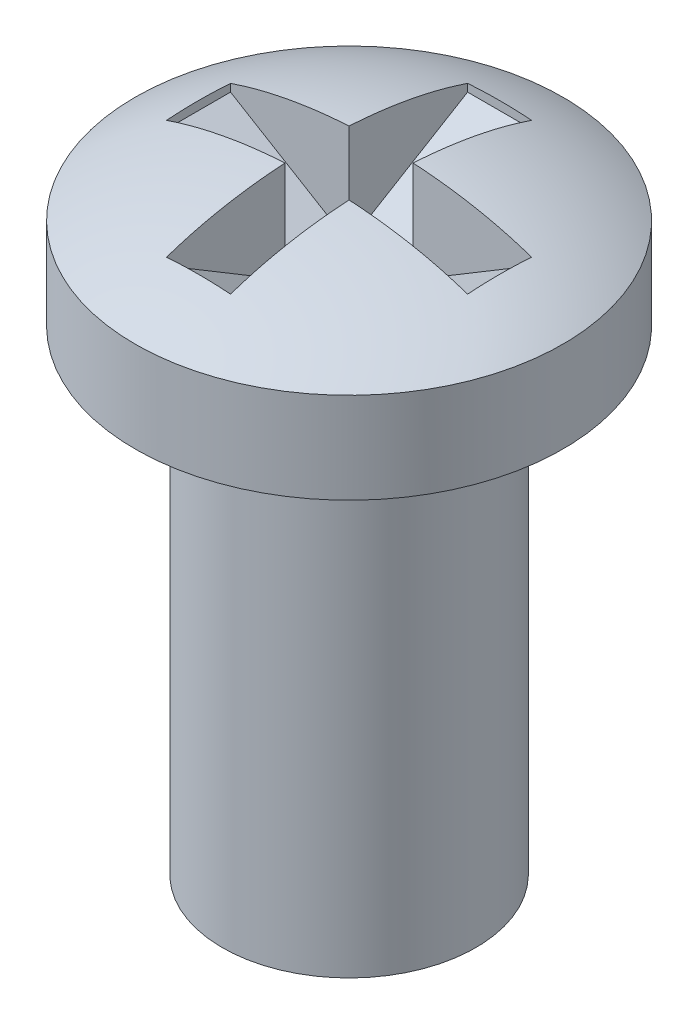
ISO-10303-21;
HEADER;
FILE_DESCRIPTION(('STEP AP214'),'2;1');
FILE_NAME('part.step','',(''),(''),'','','');
FILE_SCHEMA(('AUTOMOTIVE_DESIGN { 1 0 10303 214 1 1 1 1 }'));
ENDSEC;
DATA;
#1=APPLICATION_CONTEXT('core data for automotive mechanical design processes');
#2=APPLICATION_PROTOCOL_DEFINITION('international standard','automotive_design',2000,#1);
#3=PRODUCT_CONTEXT('',#1,'mechanical');
#4=PRODUCT('Part','Part','',(#3));
#5=PRODUCT_RELATED_PRODUCT_CATEGORY('part','',(#4));
#6=PRODUCT_DEFINITION_FORMATION('','',#4);
#7=PRODUCT_DEFINITION_CONTEXT('part definition',#1,'design');
#8=PRODUCT_DEFINITION('design','',#6,#7);
#9=PRODUCT_DEFINITION_SHAPE('','',#8);
#10=(LENGTH_UNIT() NAMED_UNIT(*) SI_UNIT(.MILLI.,.METRE.));
#11=(NAMED_UNIT(*) PLANE_ANGLE_UNIT() SI_UNIT($,.RADIAN.));
#12=(NAMED_UNIT(*) SI_UNIT($,.STERADIAN.) SOLID_ANGLE_UNIT());
#13=UNCERTAINTY_MEASURE_WITH_UNIT(LENGTH_MEASURE(1.E-05),#10,'distance_accuracy_value','');
#14=(GEOMETRIC_REPRESENTATION_CONTEXT(3) GLOBAL_UNCERTAINTY_ASSIGNED_CONTEXT((#13)) GLOBAL_UNIT_ASSIGNED_CONTEXT((#10,
#11,#12)) REPRESENTATION_CONTEXT('',''));
#15=CARTESIAN_POINT('',(0.,0.,0.));
#16=DIRECTION('',(0.,0.,1.));
#17=DIRECTION('',(1.,0.,0.));
#18=AXIS2_PLACEMENT_3D('',#15,#16,#17);
#19=CARTESIAN_POINT('',(0.,-0.2,0.202001949310081));
#20=DIRECTION('',(0.,0.,-1.));
#21=DIRECTION('',(-1.,0.,0.));
#22=AXIS2_PLACEMENT_3D('',#19,#20,#21);
#23=PLANE('',#22);
#24=DIRECTION('',(0.,-1.,0.));
#25=VECTOR('',#24,1.);
#26=CARTESIAN_POINT('',(-0.202001949310081,-0.2,0.202001949310082));
#27=LINE('',#26,#25);
#28=CARTESIAN_POINT('',(-0.202001949310081,-0.0116409944145338,0.202001949310082));
#29=VERTEX_POINT('',#28);
#30=CARTESIAN_POINT('',(-0.202001949310081,-0.649442571768954,0.202001949310082));
#31=VERTEX_POINT('',#30);
#32=EDGE_CURVE('E50',#29,#31,#27,.T.);
#33=ORIENTED_EDGE('',*,*,#32,.T.);
#34=DIRECTION('',(-0.857167300702112,0.515038074910054,0.));
#35=VECTOR('',#34,1.);
#36=CARTESIAN_POINT('',(-0.950000000000001,-0.2,0.202001949310081));
#37=LINE('',#36,#35);
#38=CARTESIAN_POINT('',(-0.950000000000001,-0.2,0.202001949310081));
#39=VERTEX_POINT('',#38);
#40=EDGE_CURVE('E128',#31,#39,#37,.T.);
#41=ORIENTED_EDGE('',*,*,#40,.T.);
#42=DIRECTION('',(0.,1.,0.));
#43=VECTOR('',#42,1.);
#44=CARTESIAN_POINT('',(-0.949999999999999,-0.2,0.202001949310084));
#45=LINE('',#44,#43);
#46=CARTESIAN_POINT('',(-0.949999999999999,-0.152171020069083,0.202001949310084));
#47=VERTEX_POINT('',#46);
#48=EDGE_CURVE('E201',#39,#47,#45,.T.);
#49=ORIENTED_EDGE('',*,*,#48,.T.);
#50=CARTESIAN_POINT('',(-0.949999999999999,-0.152171020069083,0.202001949310084));
#51=CARTESIAN_POINT('',(-0.875424344397262,-0.126727596025172,0.202001949310084));
#52=CARTESIAN_POINT('',(-0.799649331969492,-0.105016563048214,0.202001949310084));
#53=CARTESIAN_POINT('',(-0.646871079943858,-0.0685127803115854,0.202001949310083));
#54=CARTESIAN_POINT('',(-0.569876670968002,-0.0536833421681906,0.202001949310083));
#55=CARTESIAN_POINT('',(-0.444385225223556,-0.034602421050048,0.202001949310083));
#56=CARTESIAN_POINT('',(-0.396158293138948,-0.0284722555175424,0.202001949310083));
#57=CARTESIAN_POINT('',(-0.299309735390847,-0.0184188391481567,0.202001949310082));
#58=CARTESIAN_POINT('',(-0.250687327563442,-0.0145030873435489,0.202001949310082));
#59=CARTESIAN_POINT('',(-0.202001949310081,-0.0116409944145338,0.202001949310082));
#60=B_SPLINE_CURVE_WITH_KNOTS('',3,(#50,#51,#52,#53,#54,#55,#56,#57,#58,#59),.UNSPECIFIED.,.F.,
.F.,(4,2,2,2,4),(0.,0.236197192134715,0.471120235844108,0.616920567753226,0.763211735105379),.UNSPECIFIED.);
#61=EDGE_CURVE('E238',#47,#29,#60,.T.);
#62=ORIENTED_EDGE('',*,*,#61,.T.);
#63=EDGE_LOOP('',(#33,#41,#49,#62));
#64=FACE_BOUND('',#63,.T.);
#65=ADVANCED_FACE('F33',(#64),#23,.T.);
#66=CARTESIAN_POINT('',(0.,-0.2,-0.202001949310081));
#67=DIRECTION('',(0.,0.,1.));
#68=DIRECTION('',(1.,0.,0.));
#69=AXIS2_PLACEMENT_3D('',#66,#67,#68);
#70=PLANE('',#69);
#71=DIRECTION('',(0.857167300702112,-0.515038074910054,0.));
#72=VECTOR('',#71,1.);
#73=CARTESIAN_POINT('',(-0.949999999999995,-0.200000000000004,-0.202001949310077));
#74=LINE('',#73,#72);
#75=CARTESIAN_POINT('',(-0.950000000000001,-0.2,-0.202001949310077));
#76=VERTEX_POINT('',#75);
#77=CARTESIAN_POINT('',(-0.202001949310084,-0.649442571768954,-0.202001949310081));
#78=VERTEX_POINT('',#77);
#79=EDGE_CURVE('E126',#76,#78,#74,.T.);
#80=ORIENTED_EDGE('',*,*,#79,.T.);
#81=DIRECTION('',(0.,-1.,0.));
#82=VECTOR('',#81,1.);
#83=CARTESIAN_POINT('',(-0.202001949310081,-0.2,-0.20200194931008));
#84=LINE('',#83,#82);
#85=CARTESIAN_POINT('',(-0.202001949310081,-0.0116409944145356,-0.20200194931008));
#86=VERTEX_POINT('',#85);
#87=EDGE_CURVE('E137',#86,#78,#84,.T.);
#88=ORIENTED_EDGE('',*,*,#87,.F.);
#89=CARTESIAN_POINT('',(0.949999999999998,-0.152171020069083,-0.202001949310085));
#90=CARTESIAN_POINT('',(0.875562613311327,-0.126776554763624,-0.202001949310085));
#91=CARTESIAN_POINT('',(0.799941673213779,-0.105101007371732,-0.202001949310085));
#92=CARTESIAN_POINT('',(0.647177293195632,-0.0685714089569718,-0.202001949310084));
#93=CARTESIAN_POINT('',(0.570036297283043,-0.0537072126627006,-0.202001949310084));
#94=CARTESIAN_POINT('',(0.414977042048123,-0.0301313192279475,-0.202001949310083));
#95=CARTESIAN_POINT('',(0.337060267721452,-0.0214095553519167,-0.202001949310083));
#96=CARTESIAN_POINT('',(0.180735149840357,-0.00953063112849328,-0.202001949310082));
#97=CARTESIAN_POINT('',(0.102326387805852,-0.00637912464353206,-0.202001949310082));
#98=CARTESIAN_POINT('',(-0.0585072806257302,-0.00527521555590168,-0.202001949310081));
#99=CARTESIAN_POINT('',(-0.140934136395482,-0.00759467694382193,-0.202001949310081));
#100=CARTESIAN_POINT('',(-0.305387290289369,-0.0183063574876427,-0.20200194931008));
#101=CARTESIAN_POINT('',(-0.387413658566783,-0.0266974716182737,-0.20200194931008));
#102=CARTESIAN_POINT('',(-0.550571658743788,-0.050180552636103,-0.202001949310079));
#103=CARTESIAN_POINT('',(-0.631702886578557,-0.0652754281853084,-0.202001949310079));
#104=CARTESIAN_POINT('',(-0.792323405067848,-0.102930226585382,-0.202001949310078));
#105=CARTESIAN_POINT('',(-0.87181015054957,-0.125500917446105,-0.202001949310078));
#106=CARTESIAN_POINT('',(-0.950000000000001,-0.152171020069083,-0.202001949310078));
#107=B_SPLINE_CURVE_WITH_KNOTS('',3,(#89,#90,#91,#92,#93,#94,#95,#96,#97,#98,#99,#100,#101,#102,
#103,#104,#105,#106),.UNSPECIFIED.,.F.,.F.,(4,2,2,2,2,2,2,2,4),(0.,0.235736290976032,
0.471120310417273,0.706117659297484,0.941353395965122,1.1885227670823,1.43564716531706,
1.68287889205403,1.93046828621854),.UNSPECIFIED.);
#108=CARTESIAN_POINT('',(-0.950000000000001,-0.152171020069083,-0.202001949310077));
#109=VERTEX_POINT('',#108);
#110=EDGE_CURVE('E161',#86,#109,#107,.T.);
#111=ORIENTED_EDGE('',*,*,#110,.T.);
#112=DIRECTION('',(0.,1.,0.));
#113=VECTOR('',#112,1.);
#114=CARTESIAN_POINT('',(-0.950000000000001,-0.2,-0.202001949310077));
#115=LINE('',#114,#113);
#116=EDGE_CURVE('E140',#76,#109,#115,.T.);
#117=ORIENTED_EDGE('',*,*,#116,.F.);
#118=EDGE_LOOP('',(#80,#88,#111,#117));
#119=FACE_BOUND('',#118,.T.);
#120=ADVANCED_FACE('F135',(#119),#70,.T.);
#121=CARTESIAN_POINT('',(-0.950000000000001,-0.2,-2.18589527276704));
#122=DIRECTION('',(0.515038074910054,0.857167300702112,0.));
#123=DIRECTION('',(-0.857167300702112,0.515038074910054,0.));
#124=AXIS2_PLACEMENT_3D('',#121,#122,#123);
#125=PLANE('',#124);
#126=ORIENTED_EDGE('',*,*,#40,.F.);
#127=DIRECTION('',(0.,0.,-1.));
#128=VECTOR('',#127,1.);
#129=CARTESIAN_POINT('',(-0.20200194931008,-0.649442571768954,-2.18589527276704));
#130=LINE('',#129,#128);
#131=EDGE_CURVE('E11',#31,#78,#130,.T.);
#132=ORIENTED_EDGE('',*,*,#131,.T.);
#133=ORIENTED_EDGE('',*,*,#79,.F.);
#134=DIRECTION('',(0.,0.,-1.));
#135=VECTOR('',#134,1.);
#136=CARTESIAN_POINT('',(-0.950000000000001,-0.2,-0.202001949310077));
#137=LINE('',#136,#135);
#138=EDGE_CURVE('E198',#39,#76,#137,.T.);
#139=ORIENTED_EDGE('',*,*,#138,.F.);
#140=EDGE_LOOP('',(#126,#132,#133,#139));
#141=FACE_BOUND('',#140,.T.);
#142=ADVANCED_FACE('F124',(#141),#125,.T.);
#143=CARTESIAN_POINT('',(1.35,-0.326458657049954,0.));
#144=CARTESIAN_POINT('',(0.947298492008952,-0.0888666459284939,0.));
#145=CARTESIAN_POINT('',(0.46319195270935,0.,0.));
#146=CARTESIAN_POINT('',(0.,0.,0.));
#147=B_SPLINE_CURVE_WITH_KNOTS('',3,(#143,#144,#145,#146),.UNSPECIFIED.,.F.,.F.,(4,4),(0.,1.),.UNSPECIFIED.);
#148=CARTESIAN_POINT('',(0.,0.,0.));
#149=DIRECTION('',(0.,1.,0.));
#150=AXIS1_PLACEMENT('',#148,#149);
#151=SURFACE_OF_REVOLUTION('',#147,#150);
#152=CARTESIAN_POINT('',(0.,-0.326458657049954,0.));
#153=DIRECTION('',(0.,1.,0.));
#154=DIRECTION('',(-1.,0.,0.));
#155=AXIS2_PLACEMENT_3D('',#152,#153,#154);
#156=CIRCLE('',#155,1.35);
#157=CARTESIAN_POINT('',(-1.35,-0.326458657049954,0.));
#158=VERTEX_POINT('',#157);
#159=EDGE_CURVE('E306',#158,#158,#156,.T.);
#160=ORIENTED_EDGE('',*,*,#159,.T.);
#161=EDGE_LOOP('',(#160));
#162=FACE_BOUND('',#161,.T.);
#163=ORIENTED_EDGE('',*,*,#110,.F.);
#164=CARTESIAN_POINT('',(-0.202001949310081,-0.152171020069083,-0.95));
#165=CARTESIAN_POINT('',(-0.202001949310081,-0.126710006509349,-0.875378107744539));
#166=CARTESIAN_POINT('',(-0.202001949310081,-0.104991506490282,-0.799565649861563));
#167=CARTESIAN_POINT('',(-0.202001949310081,-0.0684990049865396,-0.646792301634711));
#168=CARTESIAN_POINT('',(-0.202001949310081,-0.0536811136685107,-0.569841973102474));
#169=CARTESIAN_POINT('',(-0.202001949310081,-0.0295654332701106,-0.411278968791085));
#170=CARTESIAN_POINT('',(-0.202001949310081,-0.0205712208121301,-0.3296215782476));
#171=CARTESIAN_POINT('',(-0.202001949310081,-0.0086714159755852,-0.165296852615802));
#172=CARTESIAN_POINT('',(-0.202001949310081,-0.00580774049922348,-0.0826264273564121));
#173=CARTESIAN_POINT('',(-0.20200194931008,-0.00575921192657585,0.));
#174=B_SPLINE_CURVE_WITH_KNOTS('',3,(#164,#165,#166,#167,#168,#169,#170,#171,#172,#173),
.UNSPECIFIED.,.F.,.F.,(4,2,2,2,4),(0.,0.23632227097482,0.471120215014735,0.7173394712787,
0.965236918983216),.UNSPECIFIED.);
#175=CARTESIAN_POINT('',(-0.202001949310081,-0.152171020069083,-0.95));
#176=VERTEX_POINT('',#175);
#177=EDGE_CURVE('E160',#176,#86,#174,.T.);
#178=ORIENTED_EDGE('',*,*,#177,.F.);
#179=CARTESIAN_POINT('',(0.202001949310081,-0.152171020069083,-0.95));
#180=CARTESIAN_POINT('',(0.13466796620672,-0.147304674385018,-0.95));
#181=CARTESIAN_POINT('',(0.0673339831033603,-0.144871501542985,-0.95));
#182=CARTESIAN_POINT('',(-0.0673339831033602,-0.144871501542986,-0.95));
#183=CARTESIAN_POINT('',(-0.13466796620672,-0.147304674385018,-0.95));
#184=CARTESIAN_POINT('',(-0.202001949310081,-0.152171020069083,-0.95));
#185=B_SPLINE_CURVE_WITH_KNOTS('',3,(#179,#180,#181,#182,#183,#184),.UNSPECIFIED.,.F.,.F.,(4,2,
4),(0.,0.202133793552155,0.40426758710431),.UNSPECIFIED.);
#186=CARTESIAN_POINT('',(0.202001949310081,-0.152171020069083,-0.95));
#187=VERTEX_POINT('',#186);
#188=EDGE_CURVE('E330',#187,#176,#185,.T.);
#189=ORIENTED_EDGE('',*,*,#188,.F.);
#190=CARTESIAN_POINT('',(0.202001949310081,-0.00575921192657588,0.));
#191=CARTESIAN_POINT('',(0.202001949310081,-0.00578612670404184,-0.0680239837667228));
#192=CARTESIAN_POINT('',(0.202001949310081,-0.00773517412389061,-0.136052725718251));
#193=CARTESIAN_POINT('',(0.202001949310081,-0.0157556595549117,-0.271491929632842));
#194=CARTESIAN_POINT('',(0.202001949310081,-0.0218046030467988,-0.338903741498613));
#195=CARTESIAN_POINT('',(0.202001949310081,-0.0413498649582776,-0.498092440719945));
#196=CARTESIAN_POINT('',(0.202001949310081,-0.0567742852257466,-0.589649938138518));
#197=CARTESIAN_POINT('',(0.202001949310081,-0.097061480299833,-0.771362161640744));
#198=CARTESIAN_POINT('',(0.202001949310081,-0.121994120764727,-0.861501233222844));
#199=CARTESIAN_POINT('',(0.202001949310081,-0.152171020069083,-0.95));
#200=B_SPLINE_CURVE_WITH_KNOTS('',3,(#190,#191,#192,#193,#194,#195,#196,#197,#198,#199),
.UNSPECIFIED.,.F.,.F.,(4,2,2,2,4),(0.,0.204045268956149,0.406979988240773,0.685046575253211,
0.96519701940345),.UNSPECIFIED.);
#201=CARTESIAN_POINT('',(0.202001949310081,-0.011640994414534,-0.202001949310082));
#202=VERTEX_POINT('',#201);
#203=EDGE_CURVE('E325',#202,#187,#200,.T.);
#204=ORIENTED_EDGE('',*,*,#203,.F.);
#205=CARTESIAN_POINT('',(0.949999999999998,-0.152171020069083,-0.202001949310091));
#206=VERTEX_POINT('',#205);
#207=EDGE_CURVE('E162',#206,#202,#107,.T.);
#208=ORIENTED_EDGE('',*,*,#207,.F.);
#209=CARTESIAN_POINT('',(0.950000000000002,-0.152171020069083,0.202001949310071));
#210=CARTESIAN_POINT('',(0.950000000000002,-0.147304674385018,0.13466796620671));
#211=CARTESIAN_POINT('',(0.950000000000001,-0.144871501542985,0.0673339831033503));
#212=CARTESIAN_POINT('',(0.949999999999999,-0.144871501542985,-0.0673339831033701));
#213=CARTESIAN_POINT('',(0.949999999999999,-0.147304674385018,-0.13466796620673));
#214=CARTESIAN_POINT('',(0.949999999999998,-0.152171020069083,-0.202001949310091));
#215=B_SPLINE_CURVE_WITH_KNOTS('',3,(#209,#210,#211,#212,#213,#214),.UNSPECIFIED.,.F.,.F.,(4,2,
4),(0.,0.202133793552155,0.40426758710431),.UNSPECIFIED.);
#216=CARTESIAN_POINT('',(0.950000000000002,-0.152171020069083,0.202001949310071));
#217=VERTEX_POINT('',#216);
#218=EDGE_CURVE('E348',#217,#206,#215,.T.);
#219=ORIENTED_EDGE('',*,*,#218,.F.);
#220=CARTESIAN_POINT('',(0.202001949310081,-0.0116409944145336,0.202001949310079));
#221=CARTESIAN_POINT('',(0.298489224292394,-0.0173407369928243,0.202001949310078));
#222=CARTESIAN_POINT('',(0.394921975209867,-0.027151093661734,0.202001949310077));
#223=CARTESIAN_POINT('',(0.585656345045905,-0.0560147075025495,0.202001949310075));
#224=CARTESIAN_POINT('',(0.679968345902579,-0.0750004382759704,0.202001949310074));
#225=CARTESIAN_POINT('',(0.802714371285701,-0.106881772005851,0.202001949310072));
#226=CARTESIAN_POINT('',(0.832366865714425,-0.115149566527851,0.202001949310072));
#227=CARTESIAN_POINT('',(0.891410616127561,-0.13280835277816,0.202001949310071));
#228=CARTESIAN_POINT('',(0.920801100003524,-0.142201923300362,0.202001949310071));
#229=CARTESIAN_POINT('',(0.950000000000002,-0.152171020069083,0.202001949310071));
#230=B_SPLINE_CURVE_WITH_KNOTS('',3,(#220,#221,#222,#223,#224,#225,#226,#227,#228,#229),
.UNSPECIFIED.,.F.,.F.,(4,2,2,2,4),(0.,0.290188474321296,0.578273091078854,0.670604884111923,
0.763152374575303),.UNSPECIFIED.);
#231=CARTESIAN_POINT('',(0.202001949310081,-0.0116409944145336,0.202001949310079));
#232=VERTEX_POINT('',#231);
#233=EDGE_CURVE('E353',#232,#217,#230,.T.);
#234=ORIENTED_EDGE('',*,*,#233,.F.);
#235=CARTESIAN_POINT('',(0.202001949310081,-0.152171020069083,0.95));
#236=CARTESIAN_POINT('',(0.202001949310081,-0.126727596025172,0.875424344397262));
#237=CARTESIAN_POINT('',(0.202001949310081,-0.105016563048214,0.799649331969493));
#238=CARTESIAN_POINT('',(0.202001949310081,-0.0685127803115854,0.646871079943858));
#239=CARTESIAN_POINT('',(0.202001949310081,-0.0536833421681904,0.569876670968003));
#240=CARTESIAN_POINT('',(0.202001949310081,-0.0346024210500478,0.444385225223556));
#241=CARTESIAN_POINT('',(0.202001949310081,-0.0284722555175422,0.396158293138948));
#242=CARTESIAN_POINT('',(0.202001949310081,-0.0184188391481564,0.299309735390846));
#243=CARTESIAN_POINT('',(0.202001949310081,-0.0145030873435487,0.250687327563441));
#244=CARTESIAN_POINT('',(0.202001949310081,-0.0116409944145336,0.202001949310079));
#245=B_SPLINE_CURVE_WITH_KNOTS('',3,(#235,#236,#237,#238,#239,#240,#241,#242,#243,#244),
.UNSPECIFIED.,.F.,.F.,(4,2,2,2,4),(0.,0.236197192134715,0.471120235844108,0.616920567753227,
0.763211735105381),.UNSPECIFIED.);
#246=CARTESIAN_POINT('',(0.202001949310081,-0.152171020069083,0.95));
#247=VERTEX_POINT('',#246);
#248=EDGE_CURVE('E357',#247,#232,#245,.T.);
#249=ORIENTED_EDGE('',*,*,#248,.F.);
#250=CARTESIAN_POINT('',(-0.202001949310081,-0.152171020069083,0.95));
#251=CARTESIAN_POINT('',(-0.13466796620672,-0.147304674385018,0.95));
#252=CARTESIAN_POINT('',(-0.0673339831033601,-0.144871501542986,0.95));
#253=CARTESIAN_POINT('',(0.0673339831033605,-0.144871501542986,0.95));
#254=CARTESIAN_POINT('',(0.134667966206721,-0.147304674385018,0.95));
#255=CARTESIAN_POINT('',(0.202001949310081,-0.152171020069083,0.95));
#256=B_SPLINE_CURVE_WITH_KNOTS('',3,(#250,#251,#252,#253,#254,#255),.UNSPECIFIED.,.F.,.F.,(4,2,
4),(0.,0.202133793552155,0.404267587104311),.UNSPECIFIED.);
#257=CARTESIAN_POINT('',(-0.202001949310081,-0.152171020069083,0.95));
#258=VERTEX_POINT('',#257);
#259=EDGE_CURVE('E249',#258,#247,#256,.T.);
#260=ORIENTED_EDGE('',*,*,#259,.F.);
#261=CARTESIAN_POINT('',(-0.202001949310081,-0.0116409944145338,0.202001949310082));
#262=CARTESIAN_POINT('',(-0.202001949310081,-0.0173407369928247,0.298489224292396));
#263=CARTESIAN_POINT('',(-0.202001949310081,-0.0271510936617347,0.39492197520987));
#264=CARTESIAN_POINT('',(-0.202001949310081,-0.0560147075025507,0.585656345045909));
#265=CARTESIAN_POINT('',(-0.202001949310081,-0.0750004382759719,0.679968345902583));
#266=CARTESIAN_POINT('',(-0.202001949310081,-0.106881772005853,0.802714371285705));
#267=CARTESIAN_POINT('',(-0.202001949310081,-0.115149566527852,0.832366865714428));
#268=CARTESIAN_POINT('',(-0.202001949310081,-0.132808352778161,0.891410616127561));
#269=CARTESIAN_POINT('',(-0.202001949310081,-0.142201923300363,0.920801100003523));
#270=CARTESIAN_POINT('',(-0.202001949310081,-0.152171020069083,0.95));
#271=B_SPLINE_CURVE_WITH_KNOTS('',3,(#261,#262,#263,#264,#265,#266,#267,#268,#269,#270),
.UNSPECIFIED.,.F.,.F.,(4,2,2,2,4),(0.,0.290188474321299,0.578273091078858,0.670604884111924,
0.7631523745753),.UNSPECIFIED.);
#272=EDGE_CURVE('E243',#29,#258,#271,.T.);
#273=ORIENTED_EDGE('',*,*,#272,.F.);
#274=ORIENTED_EDGE('',*,*,#61,.F.);
#275=CARTESIAN_POINT('',(-0.950000000000001,-0.152171020069083,-0.202001949310077));
#276=CARTESIAN_POINT('',(-0.95,-0.147304674385018,-0.134667966206717));
#277=CARTESIAN_POINT('',(-0.95,-0.144871501542986,-0.0673339831033569));
#278=CARTESIAN_POINT('',(-0.95,-0.144871501542986,0.0673339831033636));
#279=CARTESIAN_POINT('',(-0.95,-0.147304674385018,0.134667966206724));
#280=CARTESIAN_POINT('',(-0.95,-0.152171020069083,0.202001949310084));
#281=B_SPLINE_CURVE_WITH_KNOTS('',3,(#275,#276,#277,#278,#279,#280),.UNSPECIFIED.,.F.,.F.,(4,2,
4),(0.,0.202133793552155,0.40426758710431),.UNSPECIFIED.);
#282=EDGE_CURVE('E233',#109,#47,#281,.T.);
#283=ORIENTED_EDGE('',*,*,#282,.F.);
#284=EDGE_LOOP('',(#163,#178,#189,#204,#208,#219,#234,#249,#260,#273,#274,#283));
#285=FACE_BOUND('',#284,.T.);
#286=ADVANCED_FACE('F35',(#162,#285),#151,.T.);
#287=CARTESIAN_POINT('',(-0.202001949310081,-0.2,0.));
#288=DIRECTION('',(1.,0.,0.));
#289=DIRECTION('',(0.,0.,-1.));
#290=AXIS2_PLACEMENT_3D('',#287,#288,#289);
#291=PLANE('',#290);
#292=ORIENTED_EDGE('',*,*,#177,.T.);
#293=ORIENTED_EDGE('',*,*,#87,.T.);
#294=DIRECTION('',(0.,0.515038074910055,-0.857167300702112));
#295=VECTOR('',#294,1.);
#296=CARTESIAN_POINT('',(-0.202001949310081,-0.770817588076184,0.));
#297=LINE('',#296,#295);
#298=CARTESIAN_POINT('',(-0.202001949310081,-0.2,-0.95));
#299=VERTEX_POINT('',#298);
#300=EDGE_CURVE('E146',#78,#299,#297,.T.);
#301=ORIENTED_EDGE('',*,*,#300,.T.);
#302=DIRECTION('',(0.,1.,0.));
#303=VECTOR('',#302,1.);
#304=CARTESIAN_POINT('',(-0.202001949310081,-0.2,-0.95));
#305=LINE('',#304,#303);
#306=EDGE_CURVE('E303',#299,#176,#305,.T.);
#307=ORIENTED_EDGE('',*,*,#306,.T.);
#308=EDGE_LOOP('',(#292,#293,#301,#307));
#309=FACE_BOUND('',#308,.T.);
#310=ADVANCED_FACE('F158',(#309),#291,.T.);
#311=CARTESIAN_POINT('',(0.202001949310081,-0.2,0.));
#312=DIRECTION('',(-1.,0.,0.));
#313=DIRECTION('',(0.,0.,1.));
#314=AXIS2_PLACEMENT_3D('',#311,#312,#313);
#315=PLANE('',#314);
#316=DIRECTION('',(0.,1.,0.));
#317=VECTOR('',#316,1.);
#318=CARTESIAN_POINT('',(0.202001949310081,-0.2,-0.95));
#319=LINE('',#318,#317);
#320=CARTESIAN_POINT('',(0.202001949310081,-0.2,-0.95));
#321=VERTEX_POINT('',#320);
#322=EDGE_CURVE('E301',#321,#187,#319,.T.);
#323=ORIENTED_EDGE('',*,*,#322,.F.);
#324=DIRECTION('',(0.,-0.515038074910055,0.857167300702112));
#325=VECTOR('',#324,1.);
#326=CARTESIAN_POINT('',(0.202001949310081,-0.770817588076184,0.));
#327=LINE('',#326,#325);
#328=CARTESIAN_POINT('',(0.202001949310081,-0.649442571768954,-0.20200194931008));
#329=VERTEX_POINT('',#328);
#330=EDGE_CURVE('E294',#321,#329,#327,.T.);
#331=ORIENTED_EDGE('',*,*,#330,.T.);
#332=DIRECTION('',(0.,1.,0.));
#333=VECTOR('',#332,1.);
#334=CARTESIAN_POINT('',(0.202001949310081,-0.2,-0.202001949310082));
#335=LINE('',#334,#333);
#336=EDGE_CURVE('E204',#329,#202,#335,.T.);
#337=ORIENTED_EDGE('',*,*,#336,.T.);
#338=ORIENTED_EDGE('',*,*,#203,.T.);
#339=EDGE_LOOP('',(#323,#331,#337,#338));
#340=FACE_BOUND('',#339,.T.);
#341=ADVANCED_FACE('F298',(#340),#315,.T.);
#342=CARTESIAN_POINT('',(0.8,-3.9,0.));
#343=DIRECTION('',(0.,1.,0.));
#344=DIRECTION('',(-1.,0.,0.));
#345=AXIS2_PLACEMENT_3D('',#342,#343,#344);
#346=PLANE('',#345);
#347=CARTESIAN_POINT('',(0.,-3.9,0.));
#348=DIRECTION('',(0.,1.,0.));
#349=DIRECTION('',(-1.,0.,0.));
#350=AXIS2_PLACEMENT_3D('',#347,#348,#349);
#351=CIRCLE('',#350,0.8);
#352=CARTESIAN_POINT('',(-0.8,-3.9,0.));
#353=VERTEX_POINT('',#352);
#354=EDGE_CURVE('E322',#353,#353,#351,.T.);
#355=ORIENTED_EDGE('',*,*,#354,.F.);
#356=EDGE_LOOP('',(#355));
#357=FACE_BOUND('',#356,.T.);
#358=ADVANCED_FACE('F337',(#357),#346,.F.);
#359=CARTESIAN_POINT('',(0.,0.,0.));
#360=DIRECTION('',(0.,1.,0.));
#361=DIRECTION('',(-1.,0.,0.));
#362=AXIS2_PLACEMENT_3D('',#359,#360,#361);
#363=CYLINDRICAL_SURFACE('',#362,0.8);
#364=CARTESIAN_POINT('',(0.,-0.9,0.));
#365=DIRECTION('',(0.,1.,0.));
#366=DIRECTION('',(-1.,0.,0.));
#367=AXIS2_PLACEMENT_3D('',#364,#365,#366);
#368=CIRCLE('',#367,0.8);
#369=CARTESIAN_POINT('',(-0.8,-0.9,0.));
#370=VERTEX_POINT('',#369);
#371=EDGE_CURVE('E319',#370,#370,#368,.T.);
#372=ORIENTED_EDGE('',*,*,#371,.F.);
#373=EDGE_LOOP('',(#372));
#374=FACE_BOUND('',#373,.T.);
#375=ORIENTED_EDGE('',*,*,#354,.T.);
#376=EDGE_LOOP('',(#375));
#377=FACE_BOUND('',#376,.T.);
#378=ADVANCED_FACE('F510',(#374,#377),#363,.T.);
#379=CARTESIAN_POINT('',(1.35,-0.9,0.));
#380=DIRECTION('',(0.,1.,0.));
#381=DIRECTION('',(-1.,0.,0.));
#382=AXIS2_PLACEMENT_3D('',#379,#380,#381);
#383=PLANE('',#382);
#384=CARTESIAN_POINT('',(0.,-0.9,0.));
#385=DIRECTION('',(0.,1.,0.));
#386=DIRECTION('',(-1.,0.,0.));
#387=AXIS2_PLACEMENT_3D('',#384,#385,#386);
#388=CIRCLE('',#387,1.35);
#389=CARTESIAN_POINT('',(-1.35,-0.9,0.));
#390=VERTEX_POINT('',#389);
#391=EDGE_CURVE('E316',#390,#390,#388,.T.);
#392=ORIENTED_EDGE('',*,*,#391,.F.);
#393=EDGE_LOOP('',(#392));
#394=FACE_BOUND('',#393,.T.);
#395=ORIENTED_EDGE('',*,*,#371,.T.);
#396=EDGE_LOOP('',(#395));
#397=FACE_BOUND('',#396,.T.);
#398=ADVANCED_FACE('F501',(#394,#397),#383,.F.);
#399=CARTESIAN_POINT('',(0.,0.,0.));
#400=DIRECTION('',(0.,1.,0.));
#401=DIRECTION('',(-1.,0.,0.));
#402=AXIS2_PLACEMENT_3D('',#399,#400,#401);
#403=CYLINDRICAL_SURFACE('',#402,1.35);
#404=ORIENTED_EDGE('',*,*,#159,.F.);
#405=EDGE_LOOP('',(#404));
#406=FACE_BOUND('',#405,.T.);
#407=ORIENTED_EDGE('',*,*,#391,.T.);
#408=EDGE_LOOP('',(#407));
#409=FACE_BOUND('',#408,.T.);
#410=ADVANCED_FACE('F279',(#406,#409),#403,.T.);
#411=CARTESIAN_POINT('',(0.202001949310081,-0.2,-0.95));
#412=DIRECTION('',(0.,0.,1.));
#413=DIRECTION('',(1.,0.,0.));
#414=AXIS2_PLACEMENT_3D('',#411,#412,#413);
#415=PLANE('',#414);
#416=ORIENTED_EDGE('',*,*,#188,.T.);
#417=ORIENTED_EDGE('',*,*,#306,.F.);
#418=DIRECTION('',(1.,0.,0.));
#419=VECTOR('',#418,1.);
#420=CARTESIAN_POINT('',(0.202001949310081,-0.2,-0.95));
#421=LINE('',#420,#419);
#422=EDGE_CURVE('E151',#299,#321,#421,.T.);
#423=ORIENTED_EDGE('',*,*,#422,.T.);
#424=ORIENTED_EDGE('',*,*,#322,.T.);
#425=EDGE_LOOP('',(#416,#417,#423,#424));
#426=FACE_BOUND('',#425,.T.);
#427=ADVANCED_FACE('F274',(#426),#415,.T.);
#428=DIRECTION('',(-0.857167300702111,-0.515038074910056,0.));
#429=VECTOR('',#428,1.);
#430=CARTESIAN_POINT('',(0.,-0.770817588076184,0.202001949310081));
#431=LINE('',#430,#429);
#432=CARTESIAN_POINT('',(0.949999999999998,-0.2,0.202001949310081));
#433=VERTEX_POINT('',#432);
#434=CARTESIAN_POINT('',(0.202001949310079,-0.649442571768955,0.202001949310081));
#435=VERTEX_POINT('',#434);
#436=EDGE_CURVE('E169',#433,#435,#431,.T.);
#437=ORIENTED_EDGE('',*,*,#436,.T.);
#438=DIRECTION('',(0.,-1.,0.));
#439=VECTOR('',#438,1.);
#440=CARTESIAN_POINT('',(0.202001949310081,-0.2,0.202001949310079));
#441=LINE('',#440,#439);
#442=EDGE_CURVE('E58',#232,#435,#441,.T.);
#443=ORIENTED_EDGE('',*,*,#442,.F.);
#444=ORIENTED_EDGE('',*,*,#233,.T.);
#445=DIRECTION('',(0.,1.,0.));
#446=VECTOR('',#445,1.);
#447=CARTESIAN_POINT('',(0.950000000000002,-0.2,0.202001949310071));
#448=LINE('',#447,#446);
#449=EDGE_CURVE('E181',#433,#217,#448,.T.);
#450=ORIENTED_EDGE('',*,*,#449,.F.);
#451=EDGE_LOOP('',(#437,#443,#444,#450));
#452=FACE_BOUND('',#451,.T.);
#453=ADVANCED_FACE('F228',(#452),#23,.T.);
#454=CARTESIAN_POINT('',(-0.950000000000001,-0.2,-0.202001949310077));
#455=DIRECTION('',(1.,0.,0.));
#456=DIRECTION('',(0.,0.,-1.));
#457=AXIS2_PLACEMENT_3D('',#454,#455,#456);
#458=PLANE('',#457);
#459=ORIENTED_EDGE('',*,*,#282,.T.);
#460=ORIENTED_EDGE('',*,*,#48,.F.);
#461=ORIENTED_EDGE('',*,*,#138,.T.);
#462=ORIENTED_EDGE('',*,*,#116,.T.);
#463=EDGE_LOOP('',(#459,#460,#461,#462));
#464=FACE_BOUND('',#463,.T.);
#465=ADVANCED_FACE('F223',(#464),#458,.T.);
#466=CARTESIAN_POINT('',(-0.202001949310081,-0.2,0.));
#467=DIRECTION('',(1.,0.,0.));
#468=DIRECTION('',(0.,0.,-1.));
#469=AXIS2_PLACEMENT_3D('',#466,#467,#468);
#470=PLANE('',#469);
#471=ORIENTED_EDGE('',*,*,#272,.T.);
#472=DIRECTION('',(0.,1.,0.));
#473=VECTOR('',#472,1.);
#474=CARTESIAN_POINT('',(-0.202001949310081,-0.2,0.95));
#475=LINE('',#474,#473);
#476=CARTESIAN_POINT('',(-0.202001949310082,-0.2,0.950000000000001));
#477=VERTEX_POINT('',#476);
#478=EDGE_CURVE('E191',#477,#258,#475,.T.);
#479=ORIENTED_EDGE('',*,*,#478,.F.);
#480=DIRECTION('',(0.,-0.515038074910055,-0.857167300702112));
#481=VECTOR('',#480,1.);
#482=CARTESIAN_POINT('',(-0.202001949310082,-0.199999999999999,0.950000000000001));
#483=LINE('',#482,#481);
#484=EDGE_CURVE('E155',#477,#31,#483,.T.);
#485=ORIENTED_EDGE('',*,*,#484,.T.);
#486=ORIENTED_EDGE('',*,*,#32,.F.);
#487=EDGE_LOOP('',(#471,#479,#485,#486));
#488=FACE_BOUND('',#487,.T.);
#489=ADVANCED_FACE('F227',(#488),#470,.T.);
#490=CARTESIAN_POINT('',(0.202001949310081,-0.2,0.));
#491=DIRECTION('',(-1.,0.,0.));
#492=DIRECTION('',(0.,0.,1.));
#493=AXIS2_PLACEMENT_3D('',#490,#491,#492);
#494=PLANE('',#493);
#495=ORIENTED_EDGE('',*,*,#248,.T.);
#496=ORIENTED_EDGE('',*,*,#442,.T.);
#497=DIRECTION('',(0.,0.515038074910055,0.857167300702112));
#498=VECTOR('',#497,1.);
#499=CARTESIAN_POINT('',(0.202001949310082,-0.2,0.95));
#500=LINE('',#499,#498);
#501=CARTESIAN_POINT('',(0.202001949310082,-0.2,0.95));
#502=VERTEX_POINT('',#501);
#503=EDGE_CURVE('E291',#435,#502,#500,.T.);
#504=ORIENTED_EDGE('',*,*,#503,.T.);
#505=DIRECTION('',(0.,1.,0.));
#506=VECTOR('',#505,1.);
#507=CARTESIAN_POINT('',(0.202001949310081,-0.2,0.95));
#508=LINE('',#507,#506);
#509=EDGE_CURVE('E194',#502,#247,#508,.T.);
#510=ORIENTED_EDGE('',*,*,#509,.T.);
#511=EDGE_LOOP('',(#495,#496,#504,#510));
#512=FACE_BOUND('',#511,.T.);
#513=ADVANCED_FACE('F220',(#512),#494,.T.);
#514=CARTESIAN_POINT('',(-0.202001949310081,-0.2,0.95));
#515=DIRECTION('',(0.,0.,-1.));
#516=DIRECTION('',(-1.,0.,0.));
#517=AXIS2_PLACEMENT_3D('',#514,#515,#516);
#518=PLANE('',#517);
#519=ORIENTED_EDGE('',*,*,#259,.T.);
#520=ORIENTED_EDGE('',*,*,#509,.F.);
#521=DIRECTION('',(-1.,0.,0.));
#522=VECTOR('',#521,1.);
#523=CARTESIAN_POINT('',(-0.202001949310081,-0.2,0.95));
#524=LINE('',#523,#522);
#525=EDGE_CURVE('E188',#502,#477,#524,.T.);
#526=ORIENTED_EDGE('',*,*,#525,.T.);
#527=ORIENTED_EDGE('',*,*,#478,.T.);
#528=EDGE_LOOP('',(#519,#520,#526,#527));
#529=FACE_BOUND('',#528,.T.);
#530=ADVANCED_FACE('F260',(#529),#518,.T.);
#531=CARTESIAN_POINT('',(0.950000000000002,-0.2,0.202001949310071));
#532=DIRECTION('',(-1.,0.,0.));
#533=DIRECTION('',(0.,0.,1.));
#534=AXIS2_PLACEMENT_3D('',#531,#532,#533);
#535=PLANE('',#534);
#536=ORIENTED_EDGE('',*,*,#218,.T.);
#537=DIRECTION('',(0.,1.,0.));
#538=VECTOR('',#537,1.);
#539=CARTESIAN_POINT('',(0.949999999999998,-0.2,-0.202001949310091));
#540=LINE('',#539,#538);
#541=CARTESIAN_POINT('',(0.949999999999998,-0.2,-0.202001949310091));
#542=VERTEX_POINT('',#541);
#543=EDGE_CURVE('E184',#542,#206,#540,.T.);
#544=ORIENTED_EDGE('',*,*,#543,.F.);
#545=DIRECTION('',(0.,0.,1.));
#546=VECTOR('',#545,1.);
#547=CARTESIAN_POINT('',(0.950000000000002,-0.2,0.202001949310071));
#548=LINE('',#547,#546);
#549=EDGE_CURVE('E175',#542,#433,#548,.T.);
#550=ORIENTED_EDGE('',*,*,#549,.T.);
#551=ORIENTED_EDGE('',*,*,#449,.T.);
#552=EDGE_LOOP('',(#536,#544,#550,#551));
#553=FACE_BOUND('',#552,.T.);
#554=ADVANCED_FACE('F218',(#553),#535,.T.);
#555=ORIENTED_EDGE('',*,*,#336,.F.);
#556=DIRECTION('',(0.857167300702111,0.515038074910056,0.));
#557=VECTOR('',#556,1.);
#558=CARTESIAN_POINT('',(0.,-0.77081758807618,-0.202001949310081));
#559=LINE('',#558,#557);
#560=EDGE_CURVE('E141',#329,#542,#559,.T.);
#561=ORIENTED_EDGE('',*,*,#560,.T.);
#562=ORIENTED_EDGE('',*,*,#543,.T.);
#563=ORIENTED_EDGE('',*,*,#207,.T.);
#564=EDGE_LOOP('',(#555,#561,#562,#563));
#565=FACE_BOUND('',#564,.T.);
#566=ADVANCED_FACE('F212',(#565),#70,.T.);
#567=CARTESIAN_POINT('',(0.,-0.770817588076184,-2.18589527276704));
#568=DIRECTION('',(-0.515038074910056,0.857167300702111,0.));
#569=DIRECTION('',(-0.857167300702111,-0.515038074910056,0.));
#570=AXIS2_PLACEMENT_3D('',#567,#568,#569);
#571=PLANE('',#570);
#572=DIRECTION('',(0.,0.,-1.));
#573=VECTOR('',#572,1.);
#574=CARTESIAN_POINT('',(0.20200194931008,-0.649442571768954,-2.18589527276704));
#575=LINE('',#574,#573);
#576=EDGE_CURVE('E43',#435,#329,#575,.T.);
#577=ORIENTED_EDGE('',*,*,#576,.F.);
#578=ORIENTED_EDGE('',*,*,#436,.F.);
#579=ORIENTED_EDGE('',*,*,#549,.F.);
#580=ORIENTED_EDGE('',*,*,#560,.F.);
#581=EDGE_LOOP('',(#577,#578,#579,#580));
#582=FACE_BOUND('',#581,.T.);
#583=ADVANCED_FACE('F217',(#582),#571,.T.);
#584=CARTESIAN_POINT('',(-2.18589527276704,-0.770817588076184,0.));
#585=DIRECTION('',(0.,0.857167300702112,0.515038074910055));
#586=DIRECTION('',(0.,-0.515038074910055,0.857167300702112));
#587=AXIS2_PLACEMENT_3D('',#584,#585,#586);
#588=PLANE('',#587);
#589=ORIENTED_EDGE('',*,*,#330,.F.);
#590=ORIENTED_EDGE('',*,*,#422,.F.);
#591=ORIENTED_EDGE('',*,*,#300,.F.);
#592=DIRECTION('',(-1.,0.,0.));
#593=VECTOR('',#592,1.);
#594=CARTESIAN_POINT('',(0.,-0.649442571768954,-0.202001949310081));
#595=LINE('',#594,#593);
#596=EDGE_CURVE('E148',#329,#78,#595,.T.);
#597=ORIENTED_EDGE('',*,*,#596,.F.);
#598=EDGE_LOOP('',(#589,#590,#591,#597));
#599=FACE_BOUND('',#598,.T.);
#600=ADVANCED_FACE('F147',(#599),#588,.T.);
#601=CARTESIAN_POINT('',(-2.18589527276704,-0.2,0.950000000000001));
#602=DIRECTION('',(0.,0.857167300702112,-0.515038074910055));
#603=DIRECTION('',(0.,0.515038074910055,0.857167300702112));
#604=AXIS2_PLACEMENT_3D('',#601,#602,#603);
#605=PLANE('',#604);
#606=ORIENTED_EDGE('',*,*,#484,.F.);
#607=ORIENTED_EDGE('',*,*,#525,.F.);
#608=ORIENTED_EDGE('',*,*,#503,.F.);
#609=DIRECTION('',(1.,0.,0.));
#610=VECTOR('',#609,1.);
#611=CARTESIAN_POINT('',(0.,-0.649442571768954,0.202001949310081));
#612=LINE('',#611,#610);
#613=EDGE_CURVE('E167',#31,#435,#612,.T.);
#614=ORIENTED_EDGE('',*,*,#613,.F.);
#615=EDGE_LOOP('',(#606,#607,#608,#614));
#616=FACE_BOUND('',#615,.T.);
#617=ADVANCED_FACE('F289',(#616),#605,.T.);
#618=CARTESIAN_POINT('',(0.,-0.649442571768954,0.));
#619=DIRECTION('',(0.,1.,0.));
#620=DIRECTION('',(-1.,0.,0.));
#621=AXIS2_PLACEMENT_3D('',#618,#619,#620);
#622=PLANE('',#621);
#623=ORIENTED_EDGE('',*,*,#131,.F.);
#624=ORIENTED_EDGE('',*,*,#613,.T.);
#625=ORIENTED_EDGE('',*,*,#576,.T.);
#626=ORIENTED_EDGE('',*,*,#596,.T.);
#627=EDGE_LOOP('',(#623,#624,#625,#626));
#628=FACE_BOUND('',#627,.T.);
#629=ADVANCED_FACE('F165',(#628),#622,.T.);
#630=CLOSED_SHELL('',(#65,#120,#142,#286,#310,#341,#358,#378,#398,#410,#427,#453,#465,#489,#513,
#530,#554,#566,#583,#600,#617,#629));
#631=MANIFOLD_SOLID_BREP('B2',#630);
#632=ADVANCED_BREP_SHAPE_REPRESENTATION('',(#18,#631),#14);
#633=SHAPE_DEFINITION_REPRESENTATION(#9,#632);
ENDSEC;
END-ISO-10303-21;
